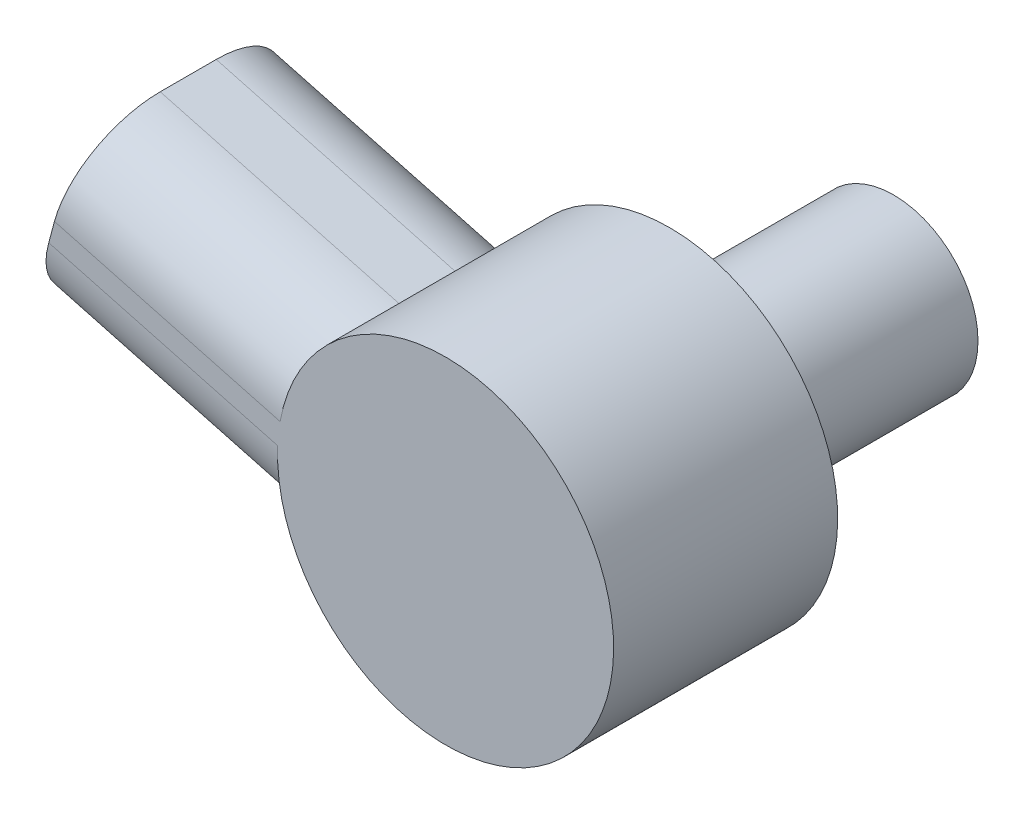
ISO-10303-21;
HEADER;
FILE_DESCRIPTION(('STEP AP214'),'2;1');
FILE_NAME('part.step','',(''),(''),'','','');
FILE_SCHEMA(('AUTOMOTIVE_DESIGN { 1 0 10303 214 1 1 1 1 }'));
ENDSEC;
DATA;
#1=APPLICATION_CONTEXT('core data for automotive mechanical design processes');
#2=APPLICATION_PROTOCOL_DEFINITION('international standard','automotive_design',2000,#1);
#3=PRODUCT_CONTEXT('',#1,'mechanical');
#4=PRODUCT('Part','Part','',(#3));
#5=PRODUCT_RELATED_PRODUCT_CATEGORY('part','',(#4));
#6=PRODUCT_DEFINITION_FORMATION('','',#4);
#7=PRODUCT_DEFINITION_CONTEXT('part definition',#1,'design');
#8=PRODUCT_DEFINITION('design','',#6,#7);
#9=PRODUCT_DEFINITION_SHAPE('','',#8);
#10=(LENGTH_UNIT() NAMED_UNIT(*) SI_UNIT(.MILLI.,.METRE.));
#11=(NAMED_UNIT(*) PLANE_ANGLE_UNIT() SI_UNIT($,.RADIAN.));
#12=(NAMED_UNIT(*) SI_UNIT($,.STERADIAN.) SOLID_ANGLE_UNIT());
#13=UNCERTAINTY_MEASURE_WITH_UNIT(LENGTH_MEASURE(1.E-05),#10,'distance_accuracy_value','');
#14=(GEOMETRIC_REPRESENTATION_CONTEXT(3) GLOBAL_UNCERTAINTY_ASSIGNED_CONTEXT((#13)) GLOBAL_UNIT_ASSIGNED_CONTEXT((#10,
#11,#12)) REPRESENTATION_CONTEXT('',''));
#15=CARTESIAN_POINT('',(0.,0.,0.));
#16=DIRECTION('',(0.,0.,1.));
#17=DIRECTION('',(1.,0.,0.));
#18=AXIS2_PLACEMENT_3D('',#15,#16,#17);
#19=CARTESIAN_POINT('',(0.,0.,40.));
#20=DIRECTION('',(0.,0.,-1.));
#21=DIRECTION('',(-1.,0.,0.));
#22=AXIS2_PLACEMENT_3D('',#19,#20,#21);
#23=CYLINDRICAL_SURFACE('',#22,30.);
#24=CARTESIAN_POINT('',(0.,0.,0.));
#25=DIRECTION('',(0.,0.,1.));
#26=DIRECTION('',(1.,0.,0.));
#27=AXIS2_PLACEMENT_3D('',#24,#25,#26);
#28=CIRCLE('',#27,30.);
#29=CARTESIAN_POINT('',(-29.9723416682267,1.2879188340418,0.));
#30=VERTEX_POINT('',#29);
#31=CARTESIAN_POINT('',(-29.5380367665379,5.24446222015701,0.));
#32=VERTEX_POINT('',#31);
#33=EDGE_CURVE('E210',#30,#32,#28,.T.);
#34=ORIENTED_EDGE('',*,*,#33,.T.);
#35=CARTESIAN_POINT('',(-29.5380367665379,5.24446222015701,0.));
#36=CARTESIAN_POINT('',(-29.5040298742118,5.43600938952069,-9.34321455274089E-07));
#37=CARTESIAN_POINT('',(-29.4681591276033,5.62720111431854,0.00375749956873188));
#38=CARTESIAN_POINT('',(-29.3927704158719,6.0085615714142,0.0188110233771672));
#39=CARTESIAN_POINT('',(-29.3532525309319,6.1987303261049,0.0301059476387477));
#40=CARTESIAN_POINT('',(-29.2293846402727,6.76707175898463,0.0753086741518917));
#41=CARTESIAN_POINT('',(-29.1396888723114,7.14325691219131,0.120534399265912));
#42=CARTESIAN_POINT('',(-28.9475324090227,7.88587231633328,0.240688901272383));
#43=CARTESIAN_POINT('',(-28.8451227233721,8.25233481975616,0.315501456023605));
#44=CARTESIAN_POINT('',(-28.6286440115631,8.97456673868699,0.494247181942344));
#45=CARTESIAN_POINT('',(-28.5145748173125,9.3303359999374,0.598180772978258));
#46=CARTESIAN_POINT('',(-28.2765017742877,10.0287347311496,0.834230105681024));
#47=CARTESIAN_POINT('',(-28.1525027062618,10.3713704081887,0.966332335862019));
#48=CARTESIAN_POINT('',(-27.896382282694,11.0417678835819,1.25765244409871));
#49=CARTESIAN_POINT('',(-27.7642603301094,11.369528585521,1.41687231686277));
#50=CARTESIAN_POINT('',(-27.4938405898555,12.0087152061614,1.7612644128485));
#51=CARTESIAN_POINT('',(-27.3555391232882,12.3201311477194,1.94645223990361));
#52=CARTESIAN_POINT('',(-27.0749564993345,12.9250891182478,2.341358796469));
#53=CARTESIAN_POINT('',(-26.9326752387043,13.2186306828925,2.55107816282625));
#54=CARTESIAN_POINT('',(-26.6403709770329,13.7985655802668,3.0028595348038));
#55=CARTESIAN_POINT('',(-26.4902718454218,14.0841558751815,3.24590296593351));
#56=CARTESIAN_POINT('',(-26.19059631518,14.6338894948064,3.75562077971601));
#57=CARTESIAN_POINT('',(-26.0410201156877,14.8980253541905,4.0223033209471));
#58=CARTESIAN_POINT('',(-25.744926957466,15.4040485972527,4.57780382549153));
#59=CARTESIAN_POINT('',(-25.5984112988858,15.6459266684223,4.86663096213937));
#60=CARTESIAN_POINT('',(-25.3110760333603,16.1066181047825,5.46478992482873));
#61=CARTESIAN_POINT('',(-25.1702566004075,16.3254307657618,5.77412237644975));
#62=CARTESIAN_POINT('',(-24.8863172039544,16.7553761888112,6.43643152008466));
#63=CARTESIAN_POINT('',(-24.7438624975403,16.9646043060998,6.79093320441269));
#64=CARTESIAN_POINT('',(-24.4718655802673,17.3546630194945,7.51973236904371));
#65=CARTESIAN_POINT('',(-24.3423176070276,17.5355063093207,7.89402089996671));
#66=CARTESIAN_POINT('',(-24.0993102914295,17.8680060381317,8.66006230931007));
#67=CARTESIAN_POINT('',(-23.9858402268388,18.0196819529518,9.05180331746626));
#68=CARTESIAN_POINT('',(-23.7779564421975,18.2931219564004,9.85028644618138));
#69=CARTESIAN_POINT('',(-23.6835323248362,18.414902373107,10.2570202378545));
#70=CARTESIAN_POINT('',(-23.529464244069,18.6112155218593,11.0181766988707));
#71=CARTESIAN_POINT('',(-23.4666907172566,18.6901583183827,11.3708366938674));
#72=CARTESIAN_POINT('',(-23.3579657422154,18.82585889499,12.0829163939464));
#73=CARTESIAN_POINT('',(-23.3120113844901,18.8826205122436,12.4423349185705));
#74=CARTESIAN_POINT('',(-23.2379039159704,18.9737579027069,13.1668453842967));
#75=CARTESIAN_POINT('',(-23.20980040846,19.0080713054938,13.5319502709901));
#76=CARTESIAN_POINT('',(-23.1721737974462,19.0538843476043,14.264693588261));
#77=CARTESIAN_POINT('',(-23.1626586294229,19.0653742434633,14.6323330336773));
#78=CARTESIAN_POINT('',(-23.1627387889613,19.0653489817088,15.));
#79=B_SPLINE_CURVE_WITH_KNOTS('',3,(#35,#36,#37,#38,#39,#40,#41,#42,#43,#44,#45,#46,#47,#48,#49,
#50,#51,#52,#53,#54,#55,#56,#57,#58,#59,#60,#61,#62,#63,#64,#65,#66,#67,#68,#69,#70,#71,#72,#73,
#74,#75,#76,#77,#78),.UNSPECIFIED.,.F.,.F.,(4,2,2,2,2,2,2,2,2,2,2,2,2,2,2,2,2,2,2,2,2,4),(0.,
0.583533249446237,1.16705367289728,2.33355609968314,3.49552110722352,4.65750286888922,
5.81892851833782,6.98043963638113,8.14265170743579,9.30489395660343,10.5154000198897,
11.7263255046408,12.9377553505335,14.1492221719505,15.4544380530298,16.7590685670647,
18.0628248963654,19.3658675584937,20.4652007406826,21.564343662602,22.6665276325884,
23.7691820291692),.UNSPECIFIED.);
#80=CARTESIAN_POINT('',(-23.1627387889613,19.0653489817088,15.));
#81=VERTEX_POINT('',#80);
#82=EDGE_CURVE('E57',#32,#81,#79,.T.);
#83=ORIENTED_EDGE('',*,*,#82,.T.);
#84=DIRECTION('',(0.,0.,-1.));
#85=VECTOR('',#84,1.);
#86=CARTESIAN_POINT('',(-23.1627387889613,19.0653489817088,40.));
#87=LINE('',#86,#85);
#88=CARTESIAN_POINT('',(-23.1627387889613,19.0653489817088,25.));
#89=VERTEX_POINT('',#88);
#90=EDGE_CURVE('E133',#89,#81,#87,.T.);
#91=ORIENTED_EDGE('',*,*,#90,.F.);
#92=CARTESIAN_POINT('',(-23.1627387889613,19.0653489817088,25.));
#93=CARTESIAN_POINT('',(-23.1627347387917,19.0653488769467,25.2017959847658));
#94=CARTESIAN_POINT('',(-23.1655827935163,19.0618943838357,25.4035647603579));
#95=CARTESIAN_POINT('',(-23.1769390505471,19.0480868433498,25.8066981161499));
#96=CARTESIAN_POINT('',(-23.1854470112908,19.0377340903899,26.0080627132321));
#97=CARTESIAN_POINT('',(-23.2193799326325,18.996361741299,26.6107832671496));
#98=CARTESIAN_POINT('',(-23.2532140491898,18.9550280218002,27.0110361541117));
#99=CARTESIAN_POINT('',(-23.3421396753012,18.8454086398059,27.8035472232149));
#100=CARTESIAN_POINT('',(-23.3971369453329,18.7772424319325,28.195832843941));
#101=CARTESIAN_POINT('',(-23.5268858169458,18.6144155684241,28.9715652079322));
#102=CARTESIAN_POINT('',(-23.601638930717,18.5197528846118,29.355011272139));
#103=CARTESIAN_POINT('',(-23.7688290181668,18.3046787665396,30.1099498735882));
#104=CARTESIAN_POINT('',(-23.8612379293737,18.1843081576624,30.4814603014155));
#105=CARTESIAN_POINT('',(-24.0616346384377,17.9182995716337,31.2111389641755));
#106=CARTESIAN_POINT('',(-24.169628403903,17.77265191128,31.5693020218547));
#107=CARTESIAN_POINT('',(-24.3988749319949,17.4566041653004,32.2705482771481));
#108=CARTESIAN_POINT('',(-24.5201399589788,17.286181135469,32.6136171082856));
#109=CARTESIAN_POINT('',(-24.7733499222019,16.921301311255,33.2826103520073));
#110=CARTESIAN_POINT('',(-24.9052954363671,16.7268432160239,33.6085338352726));
#111=CARTESIAN_POINT('',(-25.1851289828047,16.302682666068,34.2597891697585));
#112=CARTESIAN_POINT('',(-25.3334973264526,16.0715988477029,34.5840160695174));
#113=CARTESIAN_POINT('',(-25.636265095001,15.5841007769314,35.2095683923686));
#114=CARTESIAN_POINT('',(-25.7906620208879,15.3276969543626,35.5109031554551));
#115=CARTESIAN_POINT('',(-26.1026408166873,14.7901568970103,36.0891876150542));
#116=CARTESIAN_POINT('',(-26.2602242036376,14.509008657471,36.3661253435227));
#117=CARTESIAN_POINT('',(-26.5754768590152,13.9231684180015,36.8935395425375));
#118=CARTESIAN_POINT('',(-26.733146065755,13.6184861167695,37.1440268139861));
#119=CARTESIAN_POINT('',(-27.049840997167,12.9783254804686,37.6230864426515));
#120=CARTESIAN_POINT('',(-27.2087930338569,12.6422473047271,37.8509076302689));
#121=CARTESIAN_POINT('',(-27.5207109737241,11.9480229475489,38.2749516811998));
#122=CARTESIAN_POINT('',(-27.6736764350183,11.5898751421061,38.4711722153133));
#123=CARTESIAN_POINT('',(-27.970480888881,10.8540050015957,38.8299219181549));
#124=CARTESIAN_POINT('',(-28.1143295348747,10.4763041675332,38.9924871511125));
#125=CARTESIAN_POINT('',(-28.3902923112846,9.70357963045287,39.2824759269267));
#126=CARTESIAN_POINT('',(-28.5224096477602,9.30856070466633,39.4099090912184));
#127=CARTESIAN_POINT('',(-28.7386769033591,8.61295749180526,39.5987997513408));
#128=CARTESIAN_POINT('',(-28.8261443836387,8.31568436314456,39.6687805211474));
#129=CARTESIAN_POINT('',(-28.9927128119161,7.71490366759303,39.7889473665526));
#130=CARTESIAN_POINT('',(-29.0718155286523,7.41139743497317,39.8391376330245));
#131=CARTESIAN_POINT('',(-29.2210616661541,6.79917849307484,39.9195358729278));
#132=CARTESIAN_POINT('',(-29.2911940202439,6.49045987455981,39.9497193524045));
#133=CARTESIAN_POINT('',(-29.4219098132333,5.86961449937881,39.9899687453875));
#134=CARTESIAN_POINT('',(-29.482490497243,5.55748678711721,40.0000288646619));
#135=CARTESIAN_POINT('',(-29.5380367665379,5.24446222015701,40.));
#136=B_SPLINE_CURVE_WITH_KNOTS('',3,(#92,#93,#94,#95,#96,#97,#98,#99,#100,#101,#102,#103,#104,
#105,#106,#107,#108,#109,#110,#111,#112,#113,#114,#115,#116,#117,#118,#119,#120,#121,#122,#123,
#124,#125,#126,#127,#128,#129,#130,#131,#132,#133,#134,#135),.UNSPECIFIED.,.F.,.F.,(4,2,2,2,2,2,
2,2,2,2,2,2,2,2,2,2,2,2,2,2,2,4),(0.,0.605284388393846,1.2105429451521,2.42025242366854,
3.62463626414706,4.82911231962063,6.0316896477304,7.23472868347735,8.43888902326543,
9.64311456431584,10.916372362012,12.1891078488812,13.4624642434938,14.7352986425673,
16.0416647123202,17.3481270268123,18.6531820367038,19.9578792821817,20.9101806570061,
21.8622802623043,22.8155433638328,23.769080904269),.UNSPECIFIED.);
#137=CARTESIAN_POINT('',(-29.5380367665379,5.24446222015701,40.));
#138=VERTEX_POINT('',#137);
#139=EDGE_CURVE('E50',#89,#138,#136,.T.);
#140=ORIENTED_EDGE('',*,*,#139,.T.);
#141=CARTESIAN_POINT('',(0.,0.,40.));
#142=DIRECTION('',(0.,0.,1.));
#143=DIRECTION('',(1.,0.,0.));
#144=AXIS2_PLACEMENT_3D('',#141,#142,#143);
#145=CIRCLE('',#144,30.);
#146=CARTESIAN_POINT('',(-29.9723416682267,1.2879188340418,40.));
#147=VERTEX_POINT('',#146);
#148=EDGE_CURVE('E112',#147,#138,#145,.T.);
#149=ORIENTED_EDGE('',*,*,#148,.F.);
#150=CARTESIAN_POINT('',(-29.9723416682267,1.2879188340418,40.));
#151=CARTESIAN_POINT('',(-29.9816797288841,1.07067681006642,40.0000011424199));
#152=CARTESIAN_POINT('',(-29.9886474060978,0.853368587471598,39.9954939743698));
#153=CARTESIAN_POINT('',(-29.9978593088711,0.419035491370483,39.9776188777841));
#154=CARTESIAN_POINT('',(-30.0001039662614,0.202010593772931,39.9642517594701));
#155=CARTESIAN_POINT('',(-29.9997815156899,-0.447611494658615,39.9111308929285));
#156=CARTESIAN_POINT('',(-29.9901778807794,-0.879222670359713,39.8583569503837));
#157=CARTESIAN_POINT('',(-29.9529118398026,-1.73343889738543,39.7201309863874));
#158=CARTESIAN_POINT('',(-29.9253653149262,-2.1560838921921,39.6348901042609));
#159=CARTESIAN_POINT('',(-29.8533250619968,-2.99252532037701,39.4334623259692));
#160=CARTESIAN_POINT('',(-29.8088280676576,-3.40632003210101,39.3172694667831));
#161=CARTESIAN_POINT('',(-29.7043745073273,-4.22117764835699,39.0562158058931));
#162=CARTESIAN_POINT('',(-29.6444698334534,-4.62227830955136,38.9114516042627));
#163=CARTESIAN_POINT('',(-29.5106672456857,-5.41115366300297,38.5947825671082));
#164=CARTESIAN_POINT('',(-29.4367699632112,-5.79892895563768,38.4228789563136));
#165=CARTESIAN_POINT('',(-29.2765364505128,-6.56018308911379,38.0531985668372));
#166=CARTESIAN_POINT('',(-29.1901770787167,-6.93363365935811,37.8553737178057));
#167=CARTESIAN_POINT('',(-29.0069825964664,-7.6639896315953,37.4355258080058));
#168=CARTESIAN_POINT('',(-28.9101468603189,-8.02089404356022,37.2135013019243));
#169=CARTESIAN_POINT('',(-28.6957006785223,-8.75910175358296,36.7180519888661));
#170=CARTESIAN_POINT('',(-28.576995703764,-9.13809888947156,36.4416597051753));
#171=CARTESIAN_POINT('',(-28.3319373356292,-9.87172331718408,35.8612188908438));
#172=CARTESIAN_POINT('',(-28.205582876332,-10.2263471979374,35.5571665029132));
#173=CARTESIAN_POINT('',(-27.9485071578386,-10.9093612705963,34.9221705474088));
#174=CARTESIAN_POINT('',(-27.8177834234828,-11.2377362228538,34.5912115800485));
#175=CARTESIAN_POINT('',(-27.5558095638467,-11.8656228342028,33.9031921635203));
#176=CARTESIAN_POINT('',(-27.4245595489542,-12.1651402468898,33.5461369424746));
#177=CARTESIAN_POINT('',(-27.1897709318124,-12.6799438202551,32.8747716133739));
#178=CARTESIAN_POINT('',(-27.0855961897406,-12.9005637680529,32.5647671861863));
#179=CARTESIAN_POINT('',(-26.8824351294776,-13.3187343831304,31.9279818031009));
#180=CARTESIAN_POINT('',(-26.7834476610225,-13.5162901768557,31.6012045986068));
#181=CARTESIAN_POINT('',(-26.5940383626581,-13.8852423795778,30.9327311055116));
#182=CARTESIAN_POINT('',(-26.5035812033255,-14.0567486596185,30.5911057646524));
#183=CARTESIAN_POINT('',(-26.3339955316651,-14.3719425662355,29.892474032412));
#184=CARTESIAN_POINT('',(-26.2548662202886,-14.51563215521,29.5354687282228));
#185=CARTESIAN_POINT('',(-26.1182964965867,-14.7598187036298,28.8428838308992));
#186=CARTESIAN_POINT('',(-26.0594979656589,-14.8631505301312,28.5085761569345));
#187=CARTESIAN_POINT('',(-25.9563780713252,-15.0425118113802,27.8306285424223));
#188=CARTESIAN_POINT('',(-25.9120508260618,-15.1185523599262,27.4869924550791));
#189=CARTESIAN_POINT('',(-25.8394960736864,-15.2422347859996,26.7883377862948));
#190=CARTESIAN_POINT('',(-25.8114782076983,-15.2895072134989,26.4332303811767));
#191=CARTESIAN_POINT('',(-25.7832867469479,-15.3369625736292,25.8975906762106));
#192=CARTESIAN_POINT('',(-25.7761953434488,-15.348872277936,25.7183765017778));
#193=CARTESIAN_POINT('',(-25.7667199350514,-15.3647710198295,25.3594525720261));
#194=CARTESIAN_POINT('',(-25.7643364813439,-15.3687591299832,25.179742761146));
#195=CARTESIAN_POINT('',(-25.7643439000195,-15.3687534758525,25.));
#196=B_SPLINE_CURVE_WITH_KNOTS('',3,(#150,#151,#152,#153,#154,#155,#156,#157,#158,#159,#160,
#161,#162,#163,#164,#165,#166,#167,#168,#169,#170,#171,#172,#173,#174,#175,#176,#177,#178,#179,
#180,#181,#182,#183,#184,#185,#186,#187,#188,#189,#190,#191,#192,#193,#194,#195),.UNSPECIFIED.,
.F.,.F.,(4,2,2,2,2,2,2,2,2,2,2,2,2,2,2,2,2,2,2,2,2,2,4),(0.,0.652200713127473,1.30434179225267,
2.60722824490575,3.90178255252377,5.19658644175311,6.48708534642641,7.77752603094439,
9.07039460443171,10.3633404362393,11.8134188974838,13.2636998877005,14.7148168596607,
16.1656439076278,17.3481765652277,18.5304458800765,19.7075812249608,20.8846334955956,
21.9477297669813,23.0103934031091,24.0864309864952,24.6254719422728,25.1645760033909),.UNSPECIFIED.);
#197=CARTESIAN_POINT('',(-25.7643439000195,-15.3687534758525,25.));
#198=VERTEX_POINT('',#197);
#199=EDGE_CURVE('E107',#147,#198,#196,.T.);
#200=ORIENTED_EDGE('',*,*,#199,.T.);
#201=DIRECTION('',(0.,0.,-1.));
#202=VECTOR('',#201,1.);
#203=CARTESIAN_POINT('',(-25.7643439000195,-15.3687534758525,40.));
#204=LINE('',#203,#202);
#205=CARTESIAN_POINT('',(-25.7643439000195,-15.3687534758525,15.));
#206=VERTEX_POINT('',#205);
#207=EDGE_CURVE('E110',#198,#206,#204,.T.);
#208=ORIENTED_EDGE('',*,*,#207,.T.);
#209=CARTESIAN_POINT('',(-25.7643439000195,-15.3687534758525,15.));
#210=CARTESIAN_POINT('',(-25.7643370399188,-15.3687586963836,14.8236067017991));
#211=CARTESIAN_POINT('',(-25.7666321718647,-15.3649180995098,14.6472445802951));
#212=CARTESIAN_POINT('',(-25.7757585561039,-15.3496054694948,14.2949880088205));
#213=CARTESIAN_POINT('',(-25.7825893213161,-15.3381342558044,14.1190935106682));
#214=CARTESIAN_POINT('',(-25.8097527489144,-15.2924163916923,13.5932682207517));
#215=CARTESIAN_POINT('',(-25.8367570129455,-15.2468650784519,13.244584085336));
#216=CARTESIAN_POINT('',(-25.906769294577,-15.1275894441801,12.5580847835202));
#217=CARTESIAN_POINT('',(-25.9495857798383,-15.0542020230229,12.2201900856016));
#218=CARTESIAN_POINT('',(-26.0492940912593,-14.881002872553,11.553300808319));
#219=CARTESIAN_POINT('',(-26.1061903952634,-14.7811827360607,11.2243090973951));
#220=CARTESIAN_POINT('',(-26.231393470875,-14.5578239993987,10.5789604088616));
#221=CARTESIAN_POINT('',(-26.2996326701154,-14.4344252477358,10.2625415993825));
#222=CARTESIAN_POINT('',(-26.4453894468729,-14.1656209393632,9.64155721014711));
#223=CARTESIAN_POINT('',(-26.5229063504643,-14.0202169808932,9.3369907715703));
#224=CARTESIAN_POINT('',(-26.7665501521652,-13.5526752231597,8.43986586356055));
#225=CARTESIAN_POINT('',(-26.9433591917124,-13.1999137560668,7.86586598036445));
#226=CARTESIAN_POINT('',(-27.2590562865707,-12.5316107224042,6.92013199480066));
#227=CARTESIAN_POINT('',(-27.3951804606673,-12.2320370087666,6.53584340319559));
#228=CARTESIAN_POINT('',(-27.6686892802013,-11.6000893988725,5.79538601216335));
#229=CARTESIAN_POINT('',(-27.8060743526292,-11.2677039892862,5.43922716268557));
#230=CARTESIAN_POINT('',(-28.077641445638,-10.5728616825844,4.75555032425592));
#231=CARTESIAN_POINT('',(-28.2118201534126,-10.210375280092,4.42806109906721));
#232=CARTESIAN_POINT('',(-28.4728623526307,-9.45804532763801,3.80303917679386));
#233=CARTESIAN_POINT('',(-28.599726693607,-9.06820496643069,3.50550299778257));
#234=CARTESIAN_POINT('',(-28.843741228734,-8.25946103971608,2.93903183364269));
#235=CARTESIAN_POINT('',(-28.9607872719426,-7.84031581269483,2.67039659064824));
#236=CARTESIAN_POINT('',(-29.1804409148389,-6.97850954331278,2.16689871256088));
#237=CARTESIAN_POINT('',(-29.2830473110486,-6.53584654508486,1.93203889245768));
#238=CARTESIAN_POINT('',(-29.4704322175116,-5.63085576415498,1.49913849717159));
#239=CARTESIAN_POINT('',(-29.5552620912237,-5.16858941062553,1.30099204011671));
#240=CARTESIAN_POINT('',(-29.7046621332842,-4.22616343355329,0.943450215723158));
#241=CARTESIAN_POINT('',(-29.7692377469544,-3.74600865818575,0.784044435621507));
#242=CARTESIAN_POINT('',(-29.8625831705214,-2.89179989600485,0.54115859241409));
#243=CARTESIAN_POINT('',(-29.8962571048615,-2.52082555225068,0.448649909446847));
#244=CARTESIAN_POINT('',(-29.9499296248413,-1.77265019079731,0.288555515548079));
#245=CARTESIAN_POINT('',(-29.9699325139043,-1.39545117085124,0.2209619648265));
#246=CARTESIAN_POINT('',(-29.9957034784737,-0.634943535070261,0.111620978811748));
#247=CARTESIAN_POINT('',(-30.0014034029114,-0.251614394441816,0.0699979926109399));
#248=CARTESIAN_POINT('',(-29.9988579248873,0.324888949332643,0.0281367993218728));
#249=CARTESIAN_POINT('',(-29.9961563476339,0.517398588343578,0.0176118469346617));
#250=CARTESIAN_POINT('',(-29.9870380703753,0.902596979804,0.00354283822229027));
#251=CARTESIAN_POINT('',(-29.9806211254935,1.09528574322359,-7.57899940490773E-07));
#252=CARTESIAN_POINT('',(-29.9723416682267,1.2879188340418,0.));
#253=B_SPLINE_CURVE_WITH_KNOTS('',3,(#209,#210,#211,#212,#213,#214,#215,#216,#217,#218,#219,
#220,#221,#222,#223,#224,#225,#226,#227,#228,#229,#230,#231,#232,#233,#234,#235,#236,#237,#238,
#239,#240,#241,#242,#243,#244,#245,#246,#247,#248,#249,#250,#251,#252),.UNSPECIFIED.,.F.,.F.,(4,
2,2,2,2,2,2,2,2,2,2,2,2,2,2,2,2,2,2,2,2,4),(0.,0.529062369423851,1.05806793208917,
2.11425280473757,3.15804274306163,4.20216506841354,5.24027667679626,6.27831292321448,
8.36076180765096,9.87687936298277,11.3935308142564,12.911686863686,14.4296662290207,
15.9621185924258,17.4946986031058,19.0227873875879,20.5504649952704,21.7008904432194,
22.8509535889052,24.0064862626625,24.5847929735936,25.1631378045587),.UNSPECIFIED.);
#254=EDGE_CURVE('E117',#206,#30,#253,.T.);
#255=ORIENTED_EDGE('',*,*,#254,.T.);
#256=EDGE_LOOP('',(#34,#83,#91,#140,#149,#200,#208,#255));
#257=FACE_BOUND('',#256,.T.);
#258=ADVANCED_FACE('F41',(#257),#23,.T.);
#259=CARTESIAN_POINT('',(-23.1627387889613,19.0653489817088,40.));
#260=DIRECTION('',(-0.258819045102518,-0.965925826289069,0.));
#261=DIRECTION('',(0.965925826289069,-0.258819045102518,0.));
#262=AXIS2_PLACEMENT_3D('',#259,#260,#261);
#263=PLANE('',#262);
#264=ORIENTED_EDGE('',*,*,#90,.T.);
#265=DIRECTION('',(-0.965925826289069,0.258819045102518,0.));
#266=VECTOR('',#265,1.);
#267=CARTESIAN_POINT('',(-23.1627387889613,19.0653489817088,15.));
#268=LINE('',#267,#266);
#269=CARTESIAN_POINT('',(-65.9428353615626,30.5282413104626,15.));
#270=VERTEX_POINT('',#269);
#271=EDGE_CURVE('E158',#81,#270,#268,.T.);
#272=ORIENTED_EDGE('',*,*,#271,.T.);
#273=DIRECTION('',(0.,0.,-1.));
#274=VECTOR('',#273,1.);
#275=CARTESIAN_POINT('',(-65.9428353615626,30.5282413104626,40.));
#276=LINE('',#275,#274);
#277=CARTESIAN_POINT('',(-65.9428353615626,30.5282413104626,25.));
#278=VERTEX_POINT('',#277);
#279=EDGE_CURVE('E137',#278,#270,#276,.T.);
#280=ORIENTED_EDGE('',*,*,#279,.F.);
#281=DIRECTION('',(-0.965925826289069,0.258819045102518,0.));
#282=VECTOR('',#281,1.);
#283=CARTESIAN_POINT('',(-23.1627387889613,19.0653489817088,25.));
#284=LINE('',#283,#282);
#285=EDGE_CURVE('E64',#278,#89,#284,.F.);
#286=ORIENTED_EDGE('',*,*,#285,.T.);
#287=EDGE_LOOP('',(#264,#272,#280,#286));
#288=FACE_BOUND('',#287,.T.);
#289=ADVANCED_FACE('F215',(#288),#263,.F.);
#290=CARTESIAN_POINT('',(-74.725635473086,-2.24961493846478,40.));
#291=DIRECTION('',(0.965925826289069,-0.258819045102517,0.));
#292=DIRECTION('',(0.258819045102517,0.965925826289069,0.));
#293=AXIS2_PLACEMENT_3D('',#290,#291,#292);
#294=PLANE('',#293);
#295=CARTESIAN_POINT('',(-70.3342354173243,14.1393131859989,20.));
#296=DIRECTION('',(-0.965925826289069,0.258819045102518,0.));
#297=DIRECTION('',(-0.258819045102518,-0.965925826289069,0.));
#298=AXIS2_PLACEMENT_3D('',#295,#296,#297);
#299=CIRCLE('',#298,15.05);
#300=CARTESIAN_POINT('',(-74.2294620461172,-0.397870499651554,20.));
#301=VERTEX_POINT('',#300);
#302=EDGE_CURVE('E365',#301,#301,#299,.T.);
#303=ORIENTED_EDGE('',*,*,#302,.F.);
#304=EDGE_LOOP('',(#303));
#305=FACE_BOUND('',#304,.T.);
#306=DIRECTION('',(-0.258819045102517,-0.965925826289069,0.));
#307=VECTOR('',#306,1.);
#308=CARTESIAN_POINT('',(-74.725635473086,-2.24961493846478,0.));
#309=LINE('',#308,#307);
#310=CARTESIAN_POINT('',(-69.8251210381003,16.0393539161266,0.));
#311=VERTEX_POINT('',#310);
#312=CARTESIAN_POINT('',(-70.8433497965482,12.2392724558713,0.));
#313=VERTEX_POINT('',#312);
#314=EDGE_CURVE('E206',#311,#313,#309,.T.);
#315=ORIENTED_EDGE('',*,*,#314,.T.);
#316=CARTESIAN_POINT('',(-70.8433497965482,12.2392724558713,15.));
#317=DIRECTION('',(0.965925826289069,-0.258819045102517,0.));
#318=DIRECTION('',(0.258819045102517,0.965925826289069,0.));
#319=AXIS2_PLACEMENT_3D('',#316,#317,#318);
#320=CIRCLE('',#319,15.);
#321=CARTESIAN_POINT('',(-74.725635473086,-2.24961493846478,15.));
#322=VERTEX_POINT('',#321);
#323=EDGE_CURVE('E150',#313,#322,#320,.F.);
#324=ORIENTED_EDGE('',*,*,#323,.T.);
#325=DIRECTION('',(0.,0.,-1.));
#326=VECTOR('',#325,1.);
#327=CARTESIAN_POINT('',(-74.725635473086,-2.24961493846478,40.));
#328=LINE('',#327,#326);
#329=CARTESIAN_POINT('',(-74.725635473086,-2.24961493846478,25.));
#330=VERTEX_POINT('',#329);
#331=EDGE_CURVE('E127',#330,#322,#328,.T.);
#332=ORIENTED_EDGE('',*,*,#331,.F.);
#333=CARTESIAN_POINT('',(-70.8433497965482,12.2392724558713,25.));
#334=DIRECTION('',(0.965925826289069,-0.258819045102517,0.));
#335=DIRECTION('',(0.258819045102517,0.965925826289069,0.));
#336=AXIS2_PLACEMENT_3D('',#333,#334,#335);
#337=CIRCLE('',#336,15.);
#338=CARTESIAN_POINT('',(-70.8433497965482,12.2392724558713,40.));
#339=VERTEX_POINT('',#338);
#340=EDGE_CURVE('E132',#330,#339,#337,.F.);
#341=ORIENTED_EDGE('',*,*,#340,.T.);
#342=DIRECTION('',(-0.258819045102517,-0.965925826289069,0.));
#343=VECTOR('',#342,1.);
#344=CARTESIAN_POINT('',(-74.725635473086,-2.24961493846478,40.));
#345=LINE('',#344,#343);
#346=CARTESIAN_POINT('',(-69.8251210381003,16.0393539161266,40.));
#347=VERTEX_POINT('',#346);
#348=EDGE_CURVE('E128',#347,#339,#345,.T.);
#349=ORIENTED_EDGE('',*,*,#348,.F.);
#350=CARTESIAN_POINT('',(-69.8251210381003,16.0393539161266,25.));
#351=DIRECTION('',(0.965925826289069,-0.258819045102517,0.));
#352=DIRECTION('',(0.258819045102517,0.965925826289069,0.));
#353=AXIS2_PLACEMENT_3D('',#350,#351,#352);
#354=CIRCLE('',#353,15.);
#355=EDGE_CURVE('E145',#347,#278,#354,.F.);
#356=ORIENTED_EDGE('',*,*,#355,.T.);
#357=ORIENTED_EDGE('',*,*,#279,.T.);
#358=CARTESIAN_POINT('',(-69.8251210381003,16.0393539161266,15.));
#359=DIRECTION('',(0.965925826289069,-0.258819045102517,0.));
#360=DIRECTION('',(0.258819045102517,0.965925826289069,0.));
#361=AXIS2_PLACEMENT_3D('',#358,#359,#360);
#362=CIRCLE('',#361,15.);
#363=EDGE_CURVE('E147',#270,#311,#362,.F.);
#364=ORIENTED_EDGE('',*,*,#363,.T.);
#365=EDGE_LOOP('',(#315,#324,#332,#341,#349,#356,#357,#364));
#366=FACE_BOUND('',#365,.T.);
#367=ADVANCED_FACE('F203',(#305,#366),#294,.F.);
#368=CARTESIAN_POINT('',(-25.7643439000195,-15.3687534758525,40.));
#369=DIRECTION('',(0.258819045102518,0.965925826289069,0.));
#370=DIRECTION('',(-0.965925826289069,0.258819045102518,0.));
#371=AXIS2_PLACEMENT_3D('',#368,#369,#370);
#372=PLANE('',#371);
#373=ORIENTED_EDGE('',*,*,#331,.T.);
#374=DIRECTION('',(0.965925826289069,-0.258819045102518,0.));
#375=VECTOR('',#374,1.);
#376=CARTESIAN_POINT('',(-25.7643439000195,-15.3687534758525,15.));
#377=LINE('',#376,#375);
#378=EDGE_CURVE('E126',#322,#206,#377,.T.);
#379=ORIENTED_EDGE('',*,*,#378,.T.);
#380=ORIENTED_EDGE('',*,*,#207,.F.);
#381=DIRECTION('',(0.965925826289069,-0.258819045102518,0.));
#382=VECTOR('',#381,1.);
#383=CARTESIAN_POINT('',(-74.725635473086,-2.24961493846478,25.));
#384=LINE('',#383,#382);
#385=EDGE_CURVE('E123',#198,#330,#384,.F.);
#386=ORIENTED_EDGE('',*,*,#385,.T.);
#387=EDGE_LOOP('',(#373,#379,#380,#386));
#388=FACE_BOUND('',#387,.T.);
#389=ADVANCED_FACE('F122',(#388),#372,.F.);
#390=CARTESIAN_POINT('',(0.,0.,40.));
#391=DIRECTION('',(0.,0.,1.));
#392=DIRECTION('',(1.,0.,0.));
#393=AXIS2_PLACEMENT_3D('',#390,#391,#392);
#394=PLANE('',#393);
#395=ORIENTED_EDGE('',*,*,#348,.T.);
#396=DIRECTION('',(0.965925826289069,-0.258819045102518,0.));
#397=VECTOR('',#396,1.);
#398=CARTESIAN_POINT('',(-21.8820582234817,-0.879866081516485,40.));
#399=LINE('',#398,#397);
#400=EDGE_CURVE('E155',#339,#147,#399,.T.);
#401=ORIENTED_EDGE('',*,*,#400,.T.);
#402=ORIENTED_EDGE('',*,*,#148,.T.);
#403=DIRECTION('',(-0.965925826289069,0.258819045102518,0.));
#404=VECTOR('',#403,1.);
#405=CARTESIAN_POINT('',(-69.8251210381003,16.0393539161266,40.));
#406=LINE('',#405,#404);
#407=EDGE_CURVE('E152',#138,#347,#406,.T.);
#408=ORIENTED_EDGE('',*,*,#407,.T.);
#409=EDGE_LOOP('',(#395,#401,#402,#408));
#410=FACE_BOUND('',#409,.T.);
#411=ADVANCED_FACE('F200',(#410),#394,.T.);
#412=CARTESIAN_POINT('',(0.,0.,0.));
#413=DIRECTION('',(0.,0.,1.));
#414=DIRECTION('',(1.,0.,0.));
#415=AXIS2_PLACEMENT_3D('',#412,#413,#414);
#416=PLANE('',#415);
#417=CARTESIAN_POINT('',(0.,0.,0.));
#418=DIRECTION('',(0.,0.,1.));
#419=DIRECTION('',(1.,0.,0.));
#420=AXIS2_PLACEMENT_3D('',#417,#418,#419);
#421=CIRCLE('',#420,15.05);
#422=CARTESIAN_POINT('',(15.05,0.,0.));
#423=VERTEX_POINT('',#422);
#424=EDGE_CURVE('E11',#423,#423,#421,.F.);
#425=ORIENTED_EDGE('',*,*,#424,.F.);
#426=EDGE_LOOP('',(#425));
#427=FACE_BOUND('',#426,.T.);
#428=ORIENTED_EDGE('',*,*,#33,.F.);
#429=DIRECTION('',(0.965925826289069,-0.258819045102518,0.));
#430=VECTOR('',#429,1.);
#431=CARTESIAN_POINT('',(-1.68578647780727,-6.29144078588939,0.));
#432=LINE('',#431,#430);
#433=EDGE_CURVE('E143',#30,#313,#432,.F.);
#434=ORIENTED_EDGE('',*,*,#433,.T.);
#435=ORIENTED_EDGE('',*,*,#314,.F.);
#436=DIRECTION('',(-0.965925826289069,0.258819045102518,0.));
#437=VECTOR('',#436,1.);
#438=CARTESIAN_POINT('',(-0.667557719359378,-2.49135932563404,0.));
#439=LINE('',#438,#437);
#440=EDGE_CURVE('E135',#311,#32,#439,.F.);
#441=ORIENTED_EDGE('',*,*,#440,.T.);
#442=EDGE_LOOP('',(#428,#434,#435,#441));
#443=FACE_BOUND('',#442,.T.);
#444=ADVANCED_FACE('F219',(#427,#443),#416,.F.);
#445=CARTESIAN_POINT('',(-31.6972023657615,3.78655138189822,20.));
#446=DIRECTION('',(-0.965925826289069,0.258819045102518,0.));
#447=DIRECTION('',(-0.258819045102518,-0.965925826289069,0.));
#448=AXIS2_PLACEMENT_3D('',#445,#446,#447);
#449=CYLINDRICAL_SURFACE('',#448,15.05);
#450=CARTESIAN_POINT('',(-31.6972023657615,3.78655138189822,20.));
#451=DIRECTION('',(-0.965925826289069,0.258819045102518,0.));
#452=DIRECTION('',(-0.258819045102518,-0.965925826289069,0.));
#453=AXIS2_PLACEMENT_3D('',#450,#451,#452);
#454=CIRCLE('',#453,15.05);
#455=CARTESIAN_POINT('',(-35.5924289945544,-10.7506323037523,20.));
#456=VERTEX_POINT('',#455);
#457=EDGE_CURVE('E212',#456,#456,#454,.T.);
#458=ORIENTED_EDGE('',*,*,#457,.F.);
#459=EDGE_LOOP('',(#458));
#460=FACE_BOUND('',#459,.T.);
#461=ORIENTED_EDGE('',*,*,#302,.T.);
#462=EDGE_LOOP('',(#461));
#463=FACE_BOUND('',#462,.T.);
#464=ADVANCED_FACE('F223',(#460,#463),#449,.F.);
#465=CARTESIAN_POINT('',(-31.6972023657615,3.78655138189822,20.));
#466=DIRECTION('',(-0.965925826289069,0.258819045102518,0.));
#467=DIRECTION('',(-0.258819045102518,-0.965925826289069,0.));
#468=AXIS2_PLACEMENT_3D('',#465,#466,#467);
#469=PLANE('',#468);
#470=ORIENTED_EDGE('',*,*,#457,.T.);
#471=EDGE_LOOP('',(#470));
#472=FACE_BOUND('',#471,.T.);
#473=ADVANCED_FACE('F178',(#472),#469,.T.);
#474=CARTESIAN_POINT('',(-21.8820582234817,-0.879866081516484,15.));
#475=DIRECTION('',(0.965925826289069,-0.258819045102518,0.));
#476=DIRECTION('',(0.258819045102518,0.965925826289069,0.));
#477=AXIS2_PLACEMENT_3D('',#474,#475,#476);
#478=CYLINDRICAL_SURFACE('',#477,15.);
#479=ORIENTED_EDGE('',*,*,#323,.F.);
#480=ORIENTED_EDGE('',*,*,#433,.F.);
#481=ORIENTED_EDGE('',*,*,#254,.F.);
#482=ORIENTED_EDGE('',*,*,#378,.F.);
#483=EDGE_LOOP('',(#479,#480,#481,#482));
#484=FACE_BOUND('',#483,.T.);
#485=ADVANCED_FACE('F175',(#484),#478,.T.);
#486=CARTESIAN_POINT('',(-1.68578647780727,-6.29144078588939,25.));
#487=DIRECTION('',(-0.965925826289069,0.258819045102518,0.));
#488=DIRECTION('',(-0.258819045102518,-0.965925826289069,0.));
#489=AXIS2_PLACEMENT_3D('',#486,#487,#488);
#490=CYLINDRICAL_SURFACE('',#489,15.);
#491=ORIENTED_EDGE('',*,*,#340,.F.);
#492=ORIENTED_EDGE('',*,*,#385,.F.);
#493=ORIENTED_EDGE('',*,*,#199,.F.);
#494=ORIENTED_EDGE('',*,*,#400,.F.);
#495=EDGE_LOOP('',(#491,#492,#493,#494));
#496=FACE_BOUND('',#495,.T.);
#497=ADVANCED_FACE('F131',(#496),#490,.T.);
#498=CARTESIAN_POINT('',(-27.0450244654991,4.57646158737281,15.));
#499=DIRECTION('',(-0.965925826289069,0.258819045102518,0.));
#500=DIRECTION('',(-0.258819045102518,-0.965925826289069,0.));
#501=AXIS2_PLACEMENT_3D('',#498,#499,#500);
#502=CYLINDRICAL_SURFACE('',#501,15.);
#503=ORIENTED_EDGE('',*,*,#82,.F.);
#504=ORIENTED_EDGE('',*,*,#440,.F.);
#505=ORIENTED_EDGE('',*,*,#363,.F.);
#506=ORIENTED_EDGE('',*,*,#271,.F.);
#507=EDGE_LOOP('',(#503,#504,#505,#506));
#508=FACE_BOUND('',#507,.T.);
#509=ADVANCED_FACE('F182',(#508),#502,.T.);
#510=CARTESIAN_POINT('',(-0.667557719359378,-2.49135932563404,25.));
#511=DIRECTION('',(0.965925826289069,-0.258819045102518,0.));
#512=DIRECTION('',(0.258819045102518,0.965925826289069,0.));
#513=AXIS2_PLACEMENT_3D('',#510,#511,#512);
#514=CYLINDRICAL_SURFACE('',#513,15.);
#515=ORIENTED_EDGE('',*,*,#139,.F.);
#516=ORIENTED_EDGE('',*,*,#285,.F.);
#517=ORIENTED_EDGE('',*,*,#355,.F.);
#518=ORIENTED_EDGE('',*,*,#407,.F.);
#519=EDGE_LOOP('',(#515,#516,#517,#518));
#520=FACE_BOUND('',#519,.T.);
#521=ADVANCED_FACE('F43',(#520),#514,.T.);
#522=CARTESIAN_POINT('',(0.,0.,-40.));
#523=DIRECTION('',(0.,0.,1.));
#524=DIRECTION('',(1.,0.,0.));
#525=AXIS2_PLACEMENT_3D('',#522,#523,#524);
#526=CYLINDRICAL_SURFACE('',#525,15.05);
#527=CARTESIAN_POINT('',(0.,0.,-40.));
#528=DIRECTION('',(0.,0.,-1.));
#529=DIRECTION('',(-1.,0.,0.));
#530=AXIS2_PLACEMENT_3D('',#527,#528,#529);
#531=CIRCLE('',#530,15.05);
#532=CARTESIAN_POINT('',(-15.05,0.,-40.));
#533=VERTEX_POINT('',#532);
#534=EDGE_CURVE('E368',#533,#533,#531,.T.);
#535=ORIENTED_EDGE('',*,*,#534,.F.);
#536=EDGE_LOOP('',(#535));
#537=FACE_BOUND('',#536,.T.);
#538=ORIENTED_EDGE('',*,*,#424,.T.);
#539=EDGE_LOOP('',(#538));
#540=FACE_BOUND('',#539,.T.);
#541=ADVANCED_FACE('F286',(#537,#540),#526,.T.);
#542=CARTESIAN_POINT('',(0.,0.,-40.));
#543=DIRECTION('',(0.,0.,-1.));
#544=DIRECTION('',(-1.,0.,0.));
#545=AXIS2_PLACEMENT_3D('',#542,#543,#544);
#546=PLANE('',#545);
#547=ORIENTED_EDGE('',*,*,#534,.T.);
#548=EDGE_LOOP('',(#547));
#549=FACE_BOUND('',#548,.T.);
#550=ADVANCED_FACE('F301',(#549),#546,.T.);
#551=CLOSED_SHELL('',(#258,#289,#367,#389,#411,#444,#464,#473,#485,#497,#509,#521,#541,#550));
#552=MANIFOLD_SOLID_BREP('B2',#551);
#553=ADVANCED_BREP_SHAPE_REPRESENTATION('',(#18,#552),#14);
#554=SHAPE_DEFINITION_REPRESENTATION(#9,#553);
ENDSEC;
END-ISO-10303-21;
